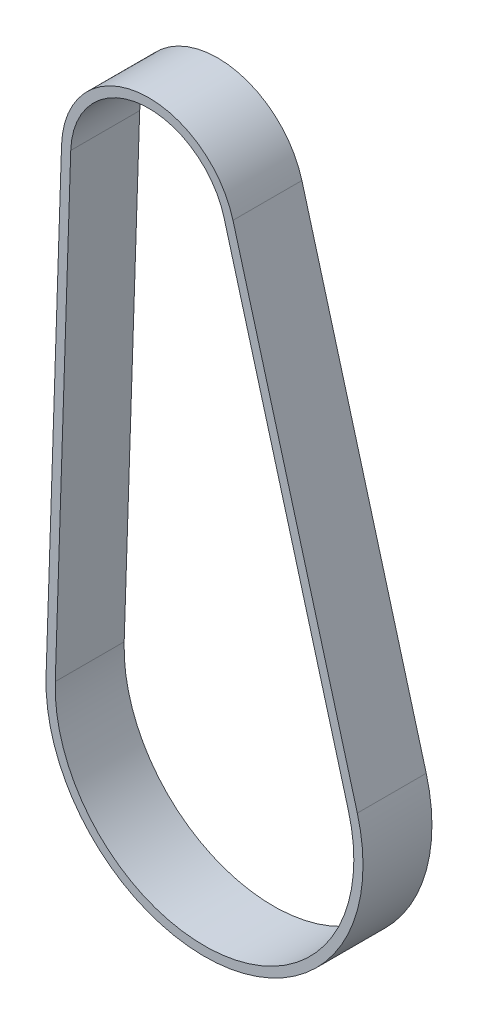
ISO-10303-21;
HEADER;
FILE_DESCRIPTION(('STEP AP214'),'2;1');
FILE_NAME('part.step','',(''),(''),'','','');
FILE_SCHEMA(('AUTOMOTIVE_DESIGN { 1 0 10303 214 1 1 1 1 }'));
ENDSEC;
DATA;
#1=APPLICATION_CONTEXT('core data for automotive mechanical design processes');
#2=APPLICATION_PROTOCOL_DEFINITION('international standard','automotive_design',2000,#1);
#3=PRODUCT_CONTEXT('',#1,'mechanical');
#4=PRODUCT('Part','Part','',(#3));
#5=PRODUCT_RELATED_PRODUCT_CATEGORY('part','',(#4));
#6=PRODUCT_DEFINITION_FORMATION('','',#4);
#7=PRODUCT_DEFINITION_CONTEXT('part definition',#1,'design');
#8=PRODUCT_DEFINITION('design','',#6,#7);
#9=PRODUCT_DEFINITION_SHAPE('','',#8);
#10=(LENGTH_UNIT() NAMED_UNIT(*) SI_UNIT(.MILLI.,.METRE.));
#11=(NAMED_UNIT(*) PLANE_ANGLE_UNIT() SI_UNIT($,.RADIAN.));
#12=(NAMED_UNIT(*) SI_UNIT($,.STERADIAN.) SOLID_ANGLE_UNIT());
#13=UNCERTAINTY_MEASURE_WITH_UNIT(LENGTH_MEASURE(1.E-05),#10,'distance_accuracy_value','');
#14=(GEOMETRIC_REPRESENTATION_CONTEXT(3) GLOBAL_UNCERTAINTY_ASSIGNED_CONTEXT((#13)) GLOBAL_UNIT_ASSIGNED_CONTEXT((#10,
#11,#12)) REPRESENTATION_CONTEXT('',''));
#15=CARTESIAN_POINT('',(0.,0.,0.));
#16=DIRECTION('',(0.,0.,1.));
#17=DIRECTION('',(1.,0.,0.));
#18=AXIS2_PLACEMENT_3D('',#15,#16,#17);
#19=CARTESIAN_POINT('',(14.834006348449,49.4300891814827,15.));
#20=DIRECTION('',(0.,0.,-1.));
#21=DIRECTION('',(-1.,0.,0.));
#22=AXIS2_PLACEMENT_3D('',#19,#20,#21);
#23=PLANE('',#22);
#24=CARTESIAN_POINT('',(14.834006348449,49.4300891814827,15.));
#25=DIRECTION('',(0.,0.,-1.));
#26=DIRECTION('',(-1.,0.,0.));
#27=AXIS2_PLACEMENT_3D('',#24,#25,#26);
#28=CIRCLE('',#27,69.);
#29=CARTESIAN_POINT('',(-54.1281412343643,51.7153026871048,15.));
#30=VERTEX_POINT('',#29);
#31=CARTESIAN_POINT('',(81.3544653883378,67.7611701404026,15.));
#32=VERTEX_POINT('',#31);
#33=EDGE_CURVE('E164',#30,#32,#28,.F.);
#34=ORIENTED_EDGE('',*,*,#33,.T.);
#35=DIRECTION('',(-0.265667839984346,0.964064623766504,0.));
#36=VECTOR('',#35,1.);
#37=CARTESIAN_POINT('',(81.3544653883378,67.7611701404026,15.));
#38=LINE('',#37,#36);
#39=CARTESIAN_POINT('',(27.2324932229214,264.160850042297,15.));
#40=VERTEX_POINT('',#39);
#41=EDGE_CURVE('E167',#32,#40,#38,.T.);
#42=ORIENTED_EDGE('',*,*,#41,.T.);
#43=CARTESIAN_POINT('',(-9.40196248020575,254.065472122892,15.));
#44=DIRECTION('',(0.,0.,-1.));
#45=DIRECTION('',(-1.,0.,0.));
#46=AXIS2_PLACEMENT_3D('',#43,#44,#45);
#47=CIRCLE('',#46,38.);
#48=CARTESIAN_POINT('',(-47.3811162214652,255.3239955028,15.));
#49=VERTEX_POINT('',#48);
#50=EDGE_CURVE('E170',#40,#49,#47,.F.);
#51=ORIENTED_EDGE('',*,*,#50,.T.);
#52=DIRECTION('',(-0.033119036313363,-0.999451414243671,0.));
#53=VECTOR('',#52,1.);
#54=CARTESIAN_POINT('',(-54.1281412343643,51.7153026871048,15.));
#55=LINE('',#54,#53);
#56=EDGE_CURVE('E172',#49,#30,#55,.T.);
#57=ORIENTED_EDGE('',*,*,#56,.T.);
#58=EDGE_LOOP('',(#34,#42,#51,#57));
#59=FACE_BOUND('',#58,.T.);
#60=CARTESIAN_POINT('',(14.834006348449,49.4300891814827,15.));
#61=DIRECTION('',(0.,0.,-1.));
#62=DIRECTION('',(-1.,0.,0.));
#63=AXIS2_PLACEMENT_3D('',#60,#61,#62);
#64=CIRCLE('',#63,65.);
#65=CARTESIAN_POINT('',(-50.1303355773896,51.5828265418513,15.));
#66=VERTEX_POINT('',#65);
#67=CARTESIAN_POINT('',(77.4982068932718,66.6984987804652,15.));
#68=VERTEX_POINT('',#67);
#69=EDGE_CURVE('E128',#66,#68,#64,.F.);
#70=ORIENTED_EDGE('',*,*,#69,.F.);
#71=DIRECTION('',(-0.033119036313363,-0.999451414243671,0.));
#72=VECTOR('',#71,1.);
#73=CARTESIAN_POINT('',(-50.1303355773896,51.5828265418513,15.));
#74=LINE('',#73,#72);
#75=CARTESIAN_POINT('',(-43.3833105644906,255.191519357547,15.));
#76=VERTEX_POINT('',#75);
#77=EDGE_CURVE('E150',#76,#66,#74,.T.);
#78=ORIENTED_EDGE('',*,*,#77,.F.);
#79=CARTESIAN_POINT('',(-9.40196248020575,254.065472122892,15.));
#80=DIRECTION('',(0.,0.,-1.));
#81=DIRECTION('',(-1.,0.,0.));
#82=AXIS2_PLACEMENT_3D('',#79,#80,#81);
#83=CIRCLE('',#82,34.);
#84=CARTESIAN_POINT('',(23.3762347278554,263.09817868236,15.));
#85=VERTEX_POINT('',#84);
#86=EDGE_CURVE('E148',#85,#76,#83,.F.);
#87=ORIENTED_EDGE('',*,*,#86,.F.);
#88=DIRECTION('',(-0.265667839984346,0.964064623766504,0.));
#89=VECTOR('',#88,1.);
#90=CARTESIAN_POINT('',(77.4982068932718,66.6984987804652,15.));
#91=LINE('',#90,#89);
#92=EDGE_CURVE('E136',#68,#85,#91,.T.);
#93=ORIENTED_EDGE('',*,*,#92,.F.);
#94=EDGE_LOOP('',(#70,#78,#87,#93));
#95=FACE_BOUND('',#94,.T.);
#96=ADVANCED_FACE('F63',(#59,#95),#23,.F.);
#97=CARTESIAN_POINT('',(14.834006348449,49.4300891814827,-15.));
#98=DIRECTION('',(0.,0.,-1.));
#99=DIRECTION('',(-1.,0.,0.));
#100=AXIS2_PLACEMENT_3D('',#97,#98,#99);
#101=PLANE('',#100);
#102=CARTESIAN_POINT('',(14.834006348449,49.4300891814827,-15.));
#103=DIRECTION('',(0.,0.,-1.));
#104=DIRECTION('',(-1.,0.,0.));
#105=AXIS2_PLACEMENT_3D('',#102,#103,#104);
#106=CIRCLE('',#105,69.);
#107=CARTESIAN_POINT('',(-54.1281412343643,51.7153026871048,-15.));
#108=VERTEX_POINT('',#107);
#109=CARTESIAN_POINT('',(81.3544653883378,67.7611701404026,-15.));
#110=VERTEX_POINT('',#109);
#111=EDGE_CURVE('E144',#108,#110,#106,.F.);
#112=ORIENTED_EDGE('',*,*,#111,.F.);
#113=DIRECTION('',(-0.033119036313363,-0.999451414243671,0.));
#114=VECTOR('',#113,1.);
#115=CARTESIAN_POINT('',(-54.1281412343643,51.7153026871048,-15.));
#116=LINE('',#115,#114);
#117=CARTESIAN_POINT('',(-47.3811162214652,255.3239955028,-15.));
#118=VERTEX_POINT('',#117);
#119=EDGE_CURVE('E168',#118,#108,#116,.T.);
#120=ORIENTED_EDGE('',*,*,#119,.F.);
#121=CARTESIAN_POINT('',(-9.40196248020575,254.065472122892,-15.));
#122=DIRECTION('',(0.,0.,-1.));
#123=DIRECTION('',(-1.,0.,0.));
#124=AXIS2_PLACEMENT_3D('',#121,#122,#123);
#125=CIRCLE('',#124,38.);
#126=CARTESIAN_POINT('',(27.2324932229214,264.160850042297,-15.));
#127=VERTEX_POINT('',#126);
#128=EDGE_CURVE('E179',#127,#118,#125,.F.);
#129=ORIENTED_EDGE('',*,*,#128,.F.);
#130=DIRECTION('',(-0.265667839984346,0.964064623766504,0.));
#131=VECTOR('',#130,1.);
#132=CARTESIAN_POINT('',(81.3544653883378,67.7611701404026,-15.));
#133=LINE('',#132,#131);
#134=EDGE_CURVE('E177',#110,#127,#133,.T.);
#135=ORIENTED_EDGE('',*,*,#134,.F.);
#136=EDGE_LOOP('',(#112,#120,#129,#135));
#137=FACE_BOUND('',#136,.T.);
#138=DIRECTION('',(-0.033119036313363,-0.999451414243671,0.));
#139=VECTOR('',#138,1.);
#140=CARTESIAN_POINT('',(-50.1303355773896,51.5828265418513,-15.));
#141=LINE('',#140,#139);
#142=CARTESIAN_POINT('',(-43.3833105644906,255.191519357547,-15.));
#143=VERTEX_POINT('',#142);
#144=CARTESIAN_POINT('',(-50.1303355773896,51.5828265418513,-15.));
#145=VERTEX_POINT('',#144);
#146=EDGE_CURVE('E137',#143,#145,#141,.T.);
#147=ORIENTED_EDGE('',*,*,#146,.T.);
#148=CARTESIAN_POINT('',(14.834006348449,49.4300891814827,-15.));
#149=DIRECTION('',(0.,0.,-1.));
#150=DIRECTION('',(-1.,0.,0.));
#151=AXIS2_PLACEMENT_3D('',#148,#149,#150);
#152=CIRCLE('',#151,65.);
#153=CARTESIAN_POINT('',(77.4982068932718,66.6984987804652,-15.));
#154=VERTEX_POINT('',#153);
#155=EDGE_CURVE('E86',#145,#154,#152,.F.);
#156=ORIENTED_EDGE('',*,*,#155,.T.);
#157=DIRECTION('',(-0.265667839984346,0.964064623766504,0.));
#158=VECTOR('',#157,1.);
#159=CARTESIAN_POINT('',(77.4982068932718,66.6984987804652,-15.));
#160=LINE('',#159,#158);
#161=CARTESIAN_POINT('',(23.3762347278554,263.09817868236,-15.));
#162=VERTEX_POINT('',#161);
#163=EDGE_CURVE('E143',#154,#162,#160,.T.);
#164=ORIENTED_EDGE('',*,*,#163,.T.);
#165=CARTESIAN_POINT('',(-9.40196248020575,254.065472122892,-15.));
#166=DIRECTION('',(0.,0.,-1.));
#167=DIRECTION('',(-1.,0.,0.));
#168=AXIS2_PLACEMENT_3D('',#165,#166,#167);
#169=CIRCLE('',#168,34.);
#170=EDGE_CURVE('E156',#162,#143,#169,.F.);
#171=ORIENTED_EDGE('',*,*,#170,.T.);
#172=EDGE_LOOP('',(#147,#156,#164,#171));
#173=FACE_BOUND('',#172,.T.);
#174=ADVANCED_FACE('F197',(#137,#173),#101,.T.);
#175=CARTESIAN_POINT('',(14.834006348449,49.4300891814827,15.));
#176=DIRECTION('',(0.,0.,-1.));
#177=DIRECTION('',(-1.,0.,0.));
#178=AXIS2_PLACEMENT_3D('',#175,#176,#177);
#179=CYLINDRICAL_SURFACE('',#178,69.);
#180=ORIENTED_EDGE('',*,*,#111,.T.);
#181=DIRECTION('',(0.,0.,-1.));
#182=VECTOR('',#181,1.);
#183=CARTESIAN_POINT('',(81.3544653883378,67.7611701404026,15.));
#184=LINE('',#183,#182);
#185=EDGE_CURVE('E12',#32,#110,#184,.T.);
#186=ORIENTED_EDGE('',*,*,#185,.F.);
#187=ORIENTED_EDGE('',*,*,#33,.F.);
#188=DIRECTION('',(0.,0.,-1.));
#189=VECTOR('',#188,1.);
#190=CARTESIAN_POINT('',(-54.1281412343643,51.7153026871048,15.));
#191=LINE('',#190,#189);
#192=EDGE_CURVE('E174',#30,#108,#191,.T.);
#193=ORIENTED_EDGE('',*,*,#192,.T.);
#194=EDGE_LOOP('',(#180,#186,#187,#193));
#195=FACE_BOUND('',#194,.T.);
#196=ADVANCED_FACE('F65',(#195),#179,.T.);
#197=CARTESIAN_POINT('',(81.3544653883378,67.7611701404026,15.));
#198=DIRECTION('',(-0.964064623766504,-0.265667839984346,0.));
#199=DIRECTION('',(0.265667839984346,-0.964064623766504,0.));
#200=AXIS2_PLACEMENT_3D('',#197,#198,#199);
#201=PLANE('',#200);
#202=ORIENTED_EDGE('',*,*,#134,.T.);
#203=DIRECTION('',(0.,0.,-1.));
#204=VECTOR('',#203,1.);
#205=CARTESIAN_POINT('',(27.2324932229214,264.160850042297,15.));
#206=LINE('',#205,#204);
#207=EDGE_CURVE('E71',#40,#127,#206,.T.);
#208=ORIENTED_EDGE('',*,*,#207,.F.);
#209=ORIENTED_EDGE('',*,*,#41,.F.);
#210=ORIENTED_EDGE('',*,*,#185,.T.);
#211=EDGE_LOOP('',(#202,#208,#209,#210));
#212=FACE_BOUND('',#211,.T.);
#213=ADVANCED_FACE('F207',(#212),#201,.F.);
#214=CARTESIAN_POINT('',(-9.40196248020575,254.065472122892,15.));
#215=DIRECTION('',(0.,0.,-1.));
#216=DIRECTION('',(-1.,0.,0.));
#217=AXIS2_PLACEMENT_3D('',#214,#215,#216);
#218=CYLINDRICAL_SURFACE('',#217,38.);
#219=ORIENTED_EDGE('',*,*,#128,.T.);
#220=DIRECTION('',(0.,0.,-1.));
#221=VECTOR('',#220,1.);
#222=CARTESIAN_POINT('',(-47.3811162214652,255.3239955028,15.));
#223=LINE('',#222,#221);
#224=EDGE_CURVE('E184',#49,#118,#223,.T.);
#225=ORIENTED_EDGE('',*,*,#224,.F.);
#226=ORIENTED_EDGE('',*,*,#50,.F.);
#227=ORIENTED_EDGE('',*,*,#207,.T.);
#228=EDGE_LOOP('',(#219,#225,#226,#227));
#229=FACE_BOUND('',#228,.T.);
#230=ADVANCED_FACE('F191',(#229),#218,.T.);
#231=CARTESIAN_POINT('',(-54.1281412343643,51.7153026871048,15.));
#232=DIRECTION('',(0.999451414243671,-0.033119036313363,0.));
#233=DIRECTION('',(0.033119036313363,0.999451414243671,0.));
#234=AXIS2_PLACEMENT_3D('',#231,#232,#233);
#235=PLANE('',#234);
#236=ORIENTED_EDGE('',*,*,#119,.T.);
#237=ORIENTED_EDGE('',*,*,#192,.F.);
#238=ORIENTED_EDGE('',*,*,#56,.F.);
#239=ORIENTED_EDGE('',*,*,#224,.T.);
#240=EDGE_LOOP('',(#236,#237,#238,#239));
#241=FACE_BOUND('',#240,.T.);
#242=ADVANCED_FACE('F201',(#241),#235,.F.);
#243=CARTESIAN_POINT('',(14.834006348449,49.4300891814827,15.));
#244=DIRECTION('',(0.,0.,-1.));
#245=DIRECTION('',(-1.,0.,0.));
#246=AXIS2_PLACEMENT_3D('',#243,#244,#245);
#247=CYLINDRICAL_SURFACE('',#246,65.);
#248=ORIENTED_EDGE('',*,*,#155,.F.);
#249=DIRECTION('',(0.,0.,-1.));
#250=VECTOR('',#249,1.);
#251=CARTESIAN_POINT('',(-50.1303355773896,51.5828265418513,15.));
#252=LINE('',#251,#250);
#253=EDGE_CURVE('E132',#66,#145,#252,.T.);
#254=ORIENTED_EDGE('',*,*,#253,.F.);
#255=ORIENTED_EDGE('',*,*,#69,.T.);
#256=DIRECTION('',(0.,0.,-1.));
#257=VECTOR('',#256,1.);
#258=CARTESIAN_POINT('',(77.4982068932718,66.6984987804652,15.));
#259=LINE('',#258,#257);
#260=EDGE_CURVE('E131',#68,#154,#259,.T.);
#261=ORIENTED_EDGE('',*,*,#260,.T.);
#262=EDGE_LOOP('',(#248,#254,#255,#261));
#263=FACE_BOUND('',#262,.T.);
#264=ADVANCED_FACE('F130',(#263),#247,.F.);
#265=CARTESIAN_POINT('',(77.4982068932718,66.6984987804652,15.));
#266=DIRECTION('',(-0.964064623766504,-0.265667839984346,0.));
#267=DIRECTION('',(0.265667839984346,-0.964064623766504,0.));
#268=AXIS2_PLACEMENT_3D('',#265,#266,#267);
#269=PLANE('',#268);
#270=ORIENTED_EDGE('',*,*,#163,.F.);
#271=ORIENTED_EDGE('',*,*,#260,.F.);
#272=ORIENTED_EDGE('',*,*,#92,.T.);
#273=DIRECTION('',(0.,0.,-1.));
#274=VECTOR('',#273,1.);
#275=CARTESIAN_POINT('',(23.3762347278554,263.09817868236,15.));
#276=LINE('',#275,#274);
#277=EDGE_CURVE('E145',#85,#162,#276,.T.);
#278=ORIENTED_EDGE('',*,*,#277,.T.);
#279=EDGE_LOOP('',(#270,#271,#272,#278));
#280=FACE_BOUND('',#279,.T.);
#281=ADVANCED_FACE('F140',(#280),#269,.T.);
#282=CARTESIAN_POINT('',(-9.40196248020575,254.065472122892,15.));
#283=DIRECTION('',(0.,0.,-1.));
#284=DIRECTION('',(-1.,0.,0.));
#285=AXIS2_PLACEMENT_3D('',#282,#283,#284);
#286=CYLINDRICAL_SURFACE('',#285,34.);
#287=ORIENTED_EDGE('',*,*,#170,.F.);
#288=ORIENTED_EDGE('',*,*,#277,.F.);
#289=ORIENTED_EDGE('',*,*,#86,.T.);
#290=DIRECTION('',(0.,0.,-1.));
#291=VECTOR('',#290,1.);
#292=CARTESIAN_POINT('',(-43.3833105644906,255.191519357547,15.));
#293=LINE('',#292,#291);
#294=EDGE_CURVE('E78',#76,#143,#293,.T.);
#295=ORIENTED_EDGE('',*,*,#294,.T.);
#296=EDGE_LOOP('',(#287,#288,#289,#295));
#297=FACE_BOUND('',#296,.T.);
#298=ADVANCED_FACE('F230',(#297),#286,.F.);
#299=CARTESIAN_POINT('',(-50.1303355773896,51.5828265418513,15.));
#300=DIRECTION('',(0.999451414243671,-0.033119036313363,0.));
#301=DIRECTION('',(0.033119036313363,0.999451414243671,0.));
#302=AXIS2_PLACEMENT_3D('',#299,#300,#301);
#303=PLANE('',#302);
#304=ORIENTED_EDGE('',*,*,#146,.F.);
#305=ORIENTED_EDGE('',*,*,#294,.F.);
#306=ORIENTED_EDGE('',*,*,#77,.T.);
#307=ORIENTED_EDGE('',*,*,#253,.T.);
#308=EDGE_LOOP('',(#304,#305,#306,#307));
#309=FACE_BOUND('',#308,.T.);
#310=ADVANCED_FACE('F234',(#309),#303,.T.);
#311=CLOSED_SHELL('',(#96,#174,#196,#213,#230,#242,#264,#281,#298,#310));
#312=MANIFOLD_SOLID_BREP('B2',#311);
#313=ADVANCED_BREP_SHAPE_REPRESENTATION('',(#18,#312),#14);
#314=SHAPE_DEFINITION_REPRESENTATION(#9,#313);
ENDSEC;
END-ISO-10303-21;
